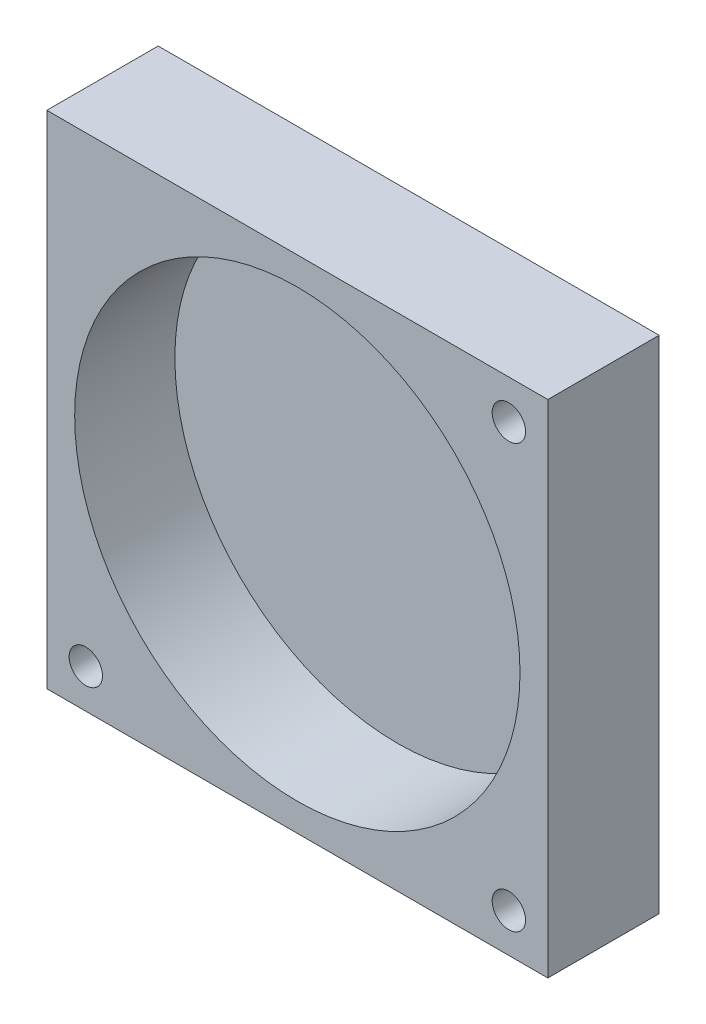
ISO-10303-21;
HEADER;
FILE_DESCRIPTION(('STEP AP214'),'2;1');
FILE_NAME('part.step','',(''),(''),'','','');
FILE_SCHEMA(('AUTOMOTIVE_DESIGN { 1 0 10303 214 1 1 1 1 }'));
ENDSEC;
DATA;
#1=APPLICATION_CONTEXT('core data for automotive mechanical design processes');
#2=APPLICATION_PROTOCOL_DEFINITION('international standard','automotive_design',2000,#1);
#3=PRODUCT_CONTEXT('',#1,'mechanical');
#4=PRODUCT('Part','Part','',(#3));
#5=PRODUCT_RELATED_PRODUCT_CATEGORY('part','',(#4));
#6=PRODUCT_DEFINITION_FORMATION('','',#4);
#7=PRODUCT_DEFINITION_CONTEXT('part definition',#1,'design');
#8=PRODUCT_DEFINITION('design','',#6,#7);
#9=PRODUCT_DEFINITION_SHAPE('','',#8);
#10=(LENGTH_UNIT() NAMED_UNIT(*) SI_UNIT(.MILLI.,.METRE.));
#11=(NAMED_UNIT(*) PLANE_ANGLE_UNIT() SI_UNIT($,.RADIAN.));
#12=(NAMED_UNIT(*) SI_UNIT($,.STERADIAN.) SOLID_ANGLE_UNIT());
#13=UNCERTAINTY_MEASURE_WITH_UNIT(LENGTH_MEASURE(1.E-05),#10,'distance_accuracy_value','');
#14=(GEOMETRIC_REPRESENTATION_CONTEXT(3) GLOBAL_UNCERTAINTY_ASSIGNED_CONTEXT((#13)) GLOBAL_UNIT_ASSIGNED_CONTEXT((#10,
#11,#12)) REPRESENTATION_CONTEXT('',''));
#15=CARTESIAN_POINT('',(0.,0.,0.));
#16=DIRECTION('',(0.,0.,1.));
#17=DIRECTION('',(1.,0.,0.));
#18=AXIS2_PLACEMENT_3D('',#15,#16,#17);
#19=CARTESIAN_POINT('',(0.,0.,10.));
#20=DIRECTION('',(0.,0.,-1.));
#21=DIRECTION('',(-1.,0.,0.));
#22=AXIS2_PLACEMENT_3D('',#19,#20,#21);
#23=CYLINDRICAL_SURFACE('',#22,20.);
#24=CARTESIAN_POINT('',(0.,0.,10.));
#25=DIRECTION('',(0.,0.,1.));
#26=DIRECTION('',(1.,0.,0.));
#27=AXIS2_PLACEMENT_3D('',#24,#25,#26);
#28=CIRCLE('',#27,20.);
#29=CARTESIAN_POINT('',(20.,0.,10.));
#30=VERTEX_POINT('',#29);
#31=EDGE_CURVE('E128',#30,#30,#28,.T.);
#32=ORIENTED_EDGE('',*,*,#31,.T.);
#33=EDGE_LOOP('',(#32));
#34=FACE_BOUND('',#33,.T.);
#35=CARTESIAN_POINT('',(0.,0.,1.));
#36=DIRECTION('',(0.,0.,-1.));
#37=DIRECTION('',(-1.,0.,0.));
#38=AXIS2_PLACEMENT_3D('',#35,#36,#37);
#39=CIRCLE('',#38,20.);
#40=CARTESIAN_POINT('',(-20.,0.,1.));
#41=VERTEX_POINT('',#40);
#42=EDGE_CURVE('E133',#41,#41,#39,.T.);
#43=ORIENTED_EDGE('',*,*,#42,.T.);
#44=EDGE_LOOP('',(#43));
#45=FACE_BOUND('',#44,.T.);
#46=ADVANCED_FACE('F33',(#34,#45),#23,.F.);
#47=CARTESIAN_POINT('',(0.,0.,10.));
#48=DIRECTION('',(0.,0.,1.));
#49=DIRECTION('',(1.,0.,0.));
#50=AXIS2_PLACEMENT_3D('',#47,#48,#49);
#51=PLANE('',#50);
#52=CARTESIAN_POINT('',(-19.,-19.,10.));
#53=DIRECTION('',(0.,0.,1.));
#54=DIRECTION('',(1.,0.,0.));
#55=AXIS2_PLACEMENT_3D('',#52,#53,#54);
#56=CIRCLE('',#55,1.5);
#57=CARTESIAN_POINT('',(-17.5,-19.,10.));
#58=VERTEX_POINT('',#57);
#59=EDGE_CURVE('E122',#58,#58,#56,.T.);
#60=ORIENTED_EDGE('',*,*,#59,.F.);
#61=EDGE_LOOP('',(#60));
#62=FACE_BOUND('',#61,.T.);
#63=CARTESIAN_POINT('',(19.,19.,10.));
#64=DIRECTION('',(0.,0.,1.));
#65=DIRECTION('',(1.,0.,0.));
#66=AXIS2_PLACEMENT_3D('',#63,#64,#65);
#67=CIRCLE('',#66,1.5);
#68=CARTESIAN_POINT('',(20.5,19.,10.));
#69=VERTEX_POINT('',#68);
#70=EDGE_CURVE('E101',#69,#69,#67,.T.);
#71=ORIENTED_EDGE('',*,*,#70,.F.);
#72=EDGE_LOOP('',(#71));
#73=FACE_BOUND('',#72,.T.);
#74=DIRECTION('',(0.,-1.,0.));
#75=VECTOR('',#74,1.);
#76=CARTESIAN_POINT('',(-22.5,22.5,10.));
#77=LINE('',#76,#75);
#78=CARTESIAN_POINT('',(-22.5,22.5,10.));
#79=VERTEX_POINT('',#78);
#80=CARTESIAN_POINT('',(-22.5,-22.5,10.));
#81=VERTEX_POINT('',#80);
#82=EDGE_CURVE('E86',#79,#81,#77,.T.);
#83=ORIENTED_EDGE('',*,*,#82,.T.);
#84=DIRECTION('',(1.,0.,0.));
#85=VECTOR('',#84,1.);
#86=CARTESIAN_POINT('',(-22.5,-22.5,10.));
#87=LINE('',#86,#85);
#88=CARTESIAN_POINT('',(22.5,-22.5,10.));
#89=VERTEX_POINT('',#88);
#90=EDGE_CURVE('E80',#81,#89,#87,.T.);
#91=ORIENTED_EDGE('',*,*,#90,.T.);
#92=DIRECTION('',(0.,1.,0.));
#93=VECTOR('',#92,1.);
#94=CARTESIAN_POINT('',(22.5,22.5,10.));
#95=LINE('',#94,#93);
#96=CARTESIAN_POINT('',(22.5,22.5,10.));
#97=VERTEX_POINT('',#96);
#98=EDGE_CURVE('E84',#89,#97,#95,.T.);
#99=ORIENTED_EDGE('',*,*,#98,.T.);
#100=DIRECTION('',(-1.,0.,0.));
#101=VECTOR('',#100,1.);
#102=CARTESIAN_POINT('',(-22.5,22.5,10.));
#103=LINE('',#102,#101);
#104=EDGE_CURVE('E50',#97,#79,#103,.T.);
#105=ORIENTED_EDGE('',*,*,#104,.T.);
#106=EDGE_LOOP('',(#83,#91,#99,#105));
#107=FACE_BOUND('',#106,.T.);
#108=CARTESIAN_POINT('',(19.,-19.,10.));
#109=DIRECTION('',(0.,0.,1.));
#110=DIRECTION('',(1.,0.,0.));
#111=AXIS2_PLACEMENT_3D('',#108,#109,#110);
#112=CIRCLE('',#111,1.5);
#113=CARTESIAN_POINT('',(20.5,-19.,10.));
#114=VERTEX_POINT('',#113);
#115=EDGE_CURVE('E116',#114,#114,#112,.T.);
#116=ORIENTED_EDGE('',*,*,#115,.F.);
#117=EDGE_LOOP('',(#116));
#118=FACE_BOUND('',#117,.T.);
#119=ORIENTED_EDGE('',*,*,#31,.F.);
#120=EDGE_LOOP('',(#119));
#121=FACE_BOUND('',#120,.T.);
#122=ADVANCED_FACE('F81',(#62,#73,#107,#118,#121),#51,.T.);
#123=CARTESIAN_POINT('',(0.,0.,0.));
#124=DIRECTION('',(0.,0.,1.));
#125=DIRECTION('',(1.,0.,0.));
#126=AXIS2_PLACEMENT_3D('',#123,#124,#125);
#127=PLANE('',#126);
#128=DIRECTION('',(0.,-1.,0.));
#129=VECTOR('',#128,1.);
#130=CARTESIAN_POINT('',(-22.5,22.5,0.));
#131=LINE('',#130,#129);
#132=CARTESIAN_POINT('',(-22.5,22.5,0.));
#133=VERTEX_POINT('',#132);
#134=CARTESIAN_POINT('',(-22.5,-22.5,0.));
#135=VERTEX_POINT('',#134);
#136=EDGE_CURVE('E98',#133,#135,#131,.T.);
#137=ORIENTED_EDGE('',*,*,#136,.F.);
#138=DIRECTION('',(-1.,0.,0.));
#139=VECTOR('',#138,1.);
#140=CARTESIAN_POINT('',(-22.5,22.5,0.));
#141=LINE('',#140,#139);
#142=CARTESIAN_POINT('',(22.5,22.5,0.));
#143=VERTEX_POINT('',#142);
#144=EDGE_CURVE('E73',#143,#133,#141,.T.);
#145=ORIENTED_EDGE('',*,*,#144,.F.);
#146=DIRECTION('',(0.,1.,0.));
#147=VECTOR('',#146,1.);
#148=CARTESIAN_POINT('',(22.5,22.5,0.));
#149=LINE('',#148,#147);
#150=CARTESIAN_POINT('',(22.5,-22.5,0.));
#151=VERTEX_POINT('',#150);
#152=EDGE_CURVE('E67',#151,#143,#149,.T.);
#153=ORIENTED_EDGE('',*,*,#152,.F.);
#154=DIRECTION('',(1.,0.,0.));
#155=VECTOR('',#154,1.);
#156=CARTESIAN_POINT('',(-22.5,-22.5,0.));
#157=LINE('',#156,#155);
#158=EDGE_CURVE('E90',#135,#151,#157,.T.);
#159=ORIENTED_EDGE('',*,*,#158,.F.);
#160=EDGE_LOOP('',(#137,#145,#153,#159));
#161=FACE_BOUND('',#160,.T.);
#162=CARTESIAN_POINT('',(19.,19.,0.));
#163=DIRECTION('',(0.,0.,1.));
#164=DIRECTION('',(1.,0.,0.));
#165=AXIS2_PLACEMENT_3D('',#162,#163,#164);
#166=CIRCLE('',#165,1.5);
#167=CARTESIAN_POINT('',(20.5,19.,0.));
#168=VERTEX_POINT('',#167);
#169=EDGE_CURVE('E113',#168,#168,#166,.T.);
#170=ORIENTED_EDGE('',*,*,#169,.T.);
#171=EDGE_LOOP('',(#170));
#172=FACE_BOUND('',#171,.T.);
#173=CARTESIAN_POINT('',(19.,-19.,0.));
#174=DIRECTION('',(0.,0.,1.));
#175=DIRECTION('',(1.,0.,0.));
#176=AXIS2_PLACEMENT_3D('',#173,#174,#175);
#177=CIRCLE('',#176,1.5);
#178=CARTESIAN_POINT('',(20.5,-19.,0.));
#179=VERTEX_POINT('',#178);
#180=EDGE_CURVE('E119',#179,#179,#177,.T.);
#181=ORIENTED_EDGE('',*,*,#180,.T.);
#182=EDGE_LOOP('',(#181));
#183=FACE_BOUND('',#182,.T.);
#184=CARTESIAN_POINT('',(-19.,-19.,0.));
#185=DIRECTION('',(0.,0.,1.));
#186=DIRECTION('',(1.,0.,0.));
#187=AXIS2_PLACEMENT_3D('',#184,#185,#186);
#188=CIRCLE('',#187,1.5);
#189=CARTESIAN_POINT('',(-17.5,-19.,0.));
#190=VERTEX_POINT('',#189);
#191=EDGE_CURVE('E125',#190,#190,#188,.T.);
#192=ORIENTED_EDGE('',*,*,#191,.T.);
#193=EDGE_LOOP('',(#192));
#194=FACE_BOUND('',#193,.T.);
#195=ADVANCED_FACE('F109',(#161,#172,#183,#194),#127,.F.);
#196=CARTESIAN_POINT('',(-22.5,22.5,10.));
#197=DIRECTION('',(1.,0.,0.));
#198=DIRECTION('',(0.,1.,0.));
#199=AXIS2_PLACEMENT_3D('',#196,#197,#198);
#200=PLANE('',#199);
#201=ORIENTED_EDGE('',*,*,#136,.T.);
#202=DIRECTION('',(0.,0.,-1.));
#203=VECTOR('',#202,1.);
#204=CARTESIAN_POINT('',(-22.5,-22.5,10.));
#205=LINE('',#204,#203);
#206=EDGE_CURVE('E11',#81,#135,#205,.T.);
#207=ORIENTED_EDGE('',*,*,#206,.F.);
#208=ORIENTED_EDGE('',*,*,#82,.F.);
#209=DIRECTION('',(0.,0.,-1.));
#210=VECTOR('',#209,1.);
#211=CARTESIAN_POINT('',(-22.5,22.5,10.));
#212=LINE('',#211,#210);
#213=EDGE_CURVE('E94',#79,#133,#212,.T.);
#214=ORIENTED_EDGE('',*,*,#213,.T.);
#215=EDGE_LOOP('',(#201,#207,#208,#214));
#216=FACE_BOUND('',#215,.T.);
#217=ADVANCED_FACE('F35',(#216),#200,.F.);
#218=CARTESIAN_POINT('',(-22.5,-22.5,10.));
#219=DIRECTION('',(0.,1.,0.));
#220=DIRECTION('',(0.,0.,1.));
#221=AXIS2_PLACEMENT_3D('',#218,#219,#220);
#222=PLANE('',#221);
#223=ORIENTED_EDGE('',*,*,#158,.T.);
#224=DIRECTION('',(0.,0.,-1.));
#225=VECTOR('',#224,1.);
#226=CARTESIAN_POINT('',(22.5,-22.5,10.));
#227=LINE('',#226,#225);
#228=EDGE_CURVE('E42',#89,#151,#227,.T.);
#229=ORIENTED_EDGE('',*,*,#228,.F.);
#230=ORIENTED_EDGE('',*,*,#90,.F.);
#231=ORIENTED_EDGE('',*,*,#206,.T.);
#232=EDGE_LOOP('',(#223,#229,#230,#231));
#233=FACE_BOUND('',#232,.T.);
#234=ADVANCED_FACE('F89',(#233),#222,.F.);
#235=CARTESIAN_POINT('',(22.5,22.5,10.));
#236=DIRECTION('',(-1.,0.,0.));
#237=DIRECTION('',(0.,-1.,0.));
#238=AXIS2_PLACEMENT_3D('',#235,#236,#237);
#239=PLANE('',#238);
#240=ORIENTED_EDGE('',*,*,#152,.T.);
#241=DIRECTION('',(0.,0.,-1.));
#242=VECTOR('',#241,1.);
#243=CARTESIAN_POINT('',(22.5,22.5,10.));
#244=LINE('',#243,#242);
#245=EDGE_CURVE('E91',#97,#143,#244,.T.);
#246=ORIENTED_EDGE('',*,*,#245,.F.);
#247=ORIENTED_EDGE('',*,*,#98,.F.);
#248=ORIENTED_EDGE('',*,*,#228,.T.);
#249=EDGE_LOOP('',(#240,#246,#247,#248));
#250=FACE_BOUND('',#249,.T.);
#251=ADVANCED_FACE('F92',(#250),#239,.F.);
#252=CARTESIAN_POINT('',(-22.5,22.5,10.));
#253=DIRECTION('',(0.,-1.,0.));
#254=DIRECTION('',(0.,0.,-1.));
#255=AXIS2_PLACEMENT_3D('',#252,#253,#254);
#256=PLANE('',#255);
#257=ORIENTED_EDGE('',*,*,#144,.T.);
#258=ORIENTED_EDGE('',*,*,#213,.F.);
#259=ORIENTED_EDGE('',*,*,#104,.F.);
#260=ORIENTED_EDGE('',*,*,#245,.T.);
#261=EDGE_LOOP('',(#257,#258,#259,#260));
#262=FACE_BOUND('',#261,.T.);
#263=ADVANCED_FACE('F106',(#262),#256,.F.);
#264=CARTESIAN_POINT('',(19.,19.,10.));
#265=DIRECTION('',(0.,0.,-1.));
#266=DIRECTION('',(-1.,0.,0.));
#267=AXIS2_PLACEMENT_3D('',#264,#265,#266);
#268=CYLINDRICAL_SURFACE('',#267,1.5);
#269=ORIENTED_EDGE('',*,*,#70,.T.);
#270=EDGE_LOOP('',(#269));
#271=FACE_BOUND('',#270,.T.);
#272=ORIENTED_EDGE('',*,*,#169,.F.);
#273=EDGE_LOOP('',(#272));
#274=FACE_BOUND('',#273,.T.);
#275=ADVANCED_FACE('F159',(#271,#274),#268,.F.);
#276=CARTESIAN_POINT('',(19.,-19.,10.));
#277=DIRECTION('',(0.,0.,-1.));
#278=DIRECTION('',(-1.,0.,0.));
#279=AXIS2_PLACEMENT_3D('',#276,#277,#278);
#280=CYLINDRICAL_SURFACE('',#279,1.5);
#281=ORIENTED_EDGE('',*,*,#115,.T.);
#282=EDGE_LOOP('',(#281));
#283=FACE_BOUND('',#282,.T.);
#284=ORIENTED_EDGE('',*,*,#180,.F.);
#285=EDGE_LOOP('',(#284));
#286=FACE_BOUND('',#285,.T.);
#287=ADVANCED_FACE('F145',(#283,#286),#280,.F.);
#288=CARTESIAN_POINT('',(-19.,-19.,10.));
#289=DIRECTION('',(0.,0.,-1.));
#290=DIRECTION('',(-1.,0.,0.));
#291=AXIS2_PLACEMENT_3D('',#288,#289,#290);
#292=CYLINDRICAL_SURFACE('',#291,1.5);
#293=ORIENTED_EDGE('',*,*,#59,.T.);
#294=EDGE_LOOP('',(#293));
#295=FACE_BOUND('',#294,.T.);
#296=ORIENTED_EDGE('',*,*,#191,.F.);
#297=EDGE_LOOP('',(#296));
#298=FACE_BOUND('',#297,.T.);
#299=ADVANCED_FACE('F140',(#295,#298),#292,.F.);
#300=CARTESIAN_POINT('',(0.,0.,1.));
#301=DIRECTION('',(0.,0.,-1.));
#302=DIRECTION('',(-1.,0.,0.));
#303=AXIS2_PLACEMENT_3D('',#300,#301,#302);
#304=PLANE('',#303);
#305=ORIENTED_EDGE('',*,*,#42,.F.);
#306=EDGE_LOOP('',(#305));
#307=FACE_BOUND('',#306,.T.);
#308=ADVANCED_FACE('F138',(#307),#304,.F.);
#309=CLOSED_SHELL('',(#46,#122,#195,#217,#234,#251,#263,#275,#287,#299,#308));
#310=MANIFOLD_SOLID_BREP('B2',#309);
#311=ADVANCED_BREP_SHAPE_REPRESENTATION('',(#18,#310),#14);
#312=SHAPE_DEFINITION_REPRESENTATION(#9,#311);
ENDSEC;
END-ISO-10303-21;
